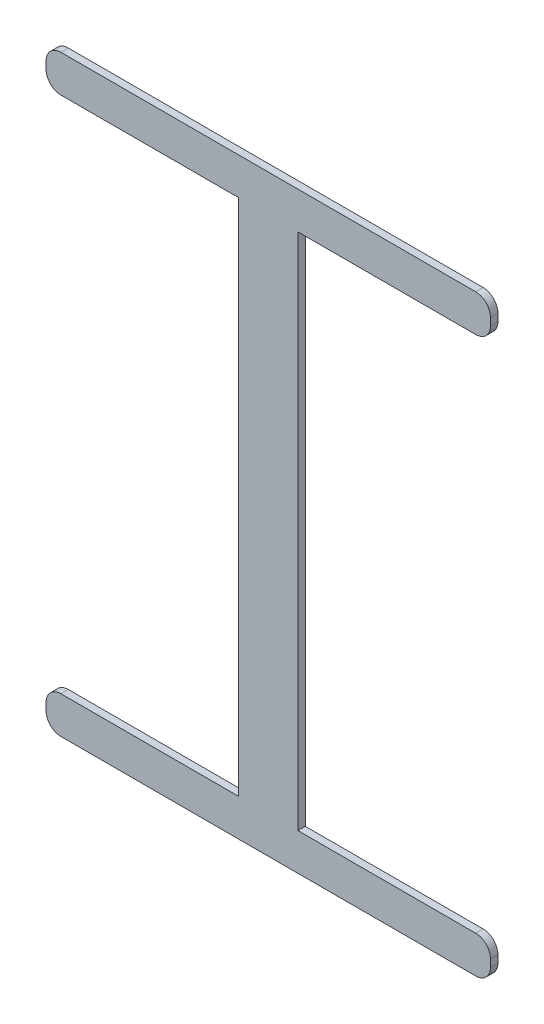
ISO-10303-21;
HEADER;
FILE_DESCRIPTION(('STEP AP214'),'2;1');
FILE_NAME('part.step','',(''),(''),'','','');
FILE_SCHEMA(('AUTOMOTIVE_DESIGN { 1 0 10303 214 1 1 1 1 }'));
ENDSEC;
DATA;
#1=APPLICATION_CONTEXT('core data for automotive mechanical design processes');
#2=APPLICATION_PROTOCOL_DEFINITION('international standard','automotive_design',2000,#1);
#3=PRODUCT_CONTEXT('',#1,'mechanical');
#4=PRODUCT('Part','Part','',(#3));
#5=PRODUCT_RELATED_PRODUCT_CATEGORY('part','',(#4));
#6=PRODUCT_DEFINITION_FORMATION('','',#4);
#7=PRODUCT_DEFINITION_CONTEXT('part definition',#1,'design');
#8=PRODUCT_DEFINITION('design','',#6,#7);
#9=PRODUCT_DEFINITION_SHAPE('','',#8);
#10=(LENGTH_UNIT() NAMED_UNIT(*) SI_UNIT(.MILLI.,.METRE.));
#11=(NAMED_UNIT(*) PLANE_ANGLE_UNIT() SI_UNIT($,.RADIAN.));
#12=(NAMED_UNIT(*) SI_UNIT($,.STERADIAN.) SOLID_ANGLE_UNIT());
#13=UNCERTAINTY_MEASURE_WITH_UNIT(LENGTH_MEASURE(1.E-05),#10,'distance_accuracy_value','');
#14=(GEOMETRIC_REPRESENTATION_CONTEXT(3) GLOBAL_UNCERTAINTY_ASSIGNED_CONTEXT((#13)) GLOBAL_UNIT_ASSIGNED_CONTEXT((#10,
#11,#12)) REPRESENTATION_CONTEXT('',''));
#15=CARTESIAN_POINT('',(0.,0.,0.));
#16=DIRECTION('',(0.,0.,1.));
#17=DIRECTION('',(1.,0.,0.));
#18=AXIS2_PLACEMENT_3D('',#15,#16,#17);
#19=CARTESIAN_POINT('',(8.00000000000001,70.,2.));
#20=DIRECTION('',(-1.,0.,0.));
#21=DIRECTION('',(0.,0.,1.));
#22=AXIS2_PLACEMENT_3D('',#19,#20,#21);
#23=PLANE('',#22);
#24=DIRECTION('',(0.,1.,0.));
#25=VECTOR('',#24,1.);
#26=CARTESIAN_POINT('',(8.00000000000001,70.,0.));
#27=LINE('',#26,#25);
#28=CARTESIAN_POINT('',(8.00000000000001,-70.,0.));
#29=VERTEX_POINT('',#28);
#30=CARTESIAN_POINT('',(8.00000000000001,70.,0.));
#31=VERTEX_POINT('',#30);
#32=EDGE_CURVE('E205',#29,#31,#27,.T.);
#33=ORIENTED_EDGE('',*,*,#32,.T.);
#34=DIRECTION('',(0.,0.,-1.));
#35=VECTOR('',#34,1.);
#36=CARTESIAN_POINT('',(8.00000000000001,70.,2.));
#37=LINE('',#36,#35);
#38=CARTESIAN_POINT('',(8.00000000000001,70.,2.));
#39=VERTEX_POINT('',#38);
#40=EDGE_CURVE('E11',#39,#31,#37,.T.);
#41=ORIENTED_EDGE('',*,*,#40,.F.);
#42=DIRECTION('',(0.,1.,0.));
#43=VECTOR('',#42,1.);
#44=CARTESIAN_POINT('',(8.00000000000001,70.,2.));
#45=LINE('',#44,#43);
#46=CARTESIAN_POINT('',(8.00000000000001,-70.,2.));
#47=VERTEX_POINT('',#46);
#48=EDGE_CURVE('E243',#47,#39,#45,.T.);
#49=ORIENTED_EDGE('',*,*,#48,.F.);
#50=DIRECTION('',(0.,0.,-1.));
#51=VECTOR('',#50,1.);
#52=CARTESIAN_POINT('',(8.00000000000001,-70.,2.));
#53=LINE('',#52,#51);
#54=EDGE_CURVE('E201',#47,#29,#53,.T.);
#55=ORIENTED_EDGE('',*,*,#54,.T.);
#56=EDGE_LOOP('',(#33,#41,#49,#55));
#57=FACE_BOUND('',#56,.T.);
#58=ADVANCED_FACE('F37',(#57),#23,.F.);
#59=CARTESIAN_POINT('',(56.,70.,2.));
#60=DIRECTION('',(0.,1.,0.));
#61=DIRECTION('',(0.,0.,1.));
#62=AXIS2_PLACEMENT_3D('',#59,#60,#61);
#63=PLANE('',#62);
#64=DIRECTION('',(1.,0.,0.));
#65=VECTOR('',#64,1.);
#66=CARTESIAN_POINT('',(56.,70.,0.));
#67=LINE('',#66,#65);
#68=CARTESIAN_POINT('',(56.,70.,0.));
#69=VERTEX_POINT('',#68);
#70=EDGE_CURVE('E208',#31,#69,#67,.T.);
#71=ORIENTED_EDGE('',*,*,#70,.T.);
#72=DIRECTION('',(0.,0.,-1.));
#73=VECTOR('',#72,1.);
#74=CARTESIAN_POINT('',(56.,70.,2.));
#75=LINE('',#74,#73);
#76=CARTESIAN_POINT('',(56.,70.,2.));
#77=VERTEX_POINT('',#76);
#78=EDGE_CURVE('E45',#77,#69,#75,.T.);
#79=ORIENTED_EDGE('',*,*,#78,.F.);
#80=DIRECTION('',(1.,0.,0.));
#81=VECTOR('',#80,1.);
#82=CARTESIAN_POINT('',(56.,70.,2.));
#83=LINE('',#82,#81);
#84=EDGE_CURVE('E132',#39,#77,#83,.T.);
#85=ORIENTED_EDGE('',*,*,#84,.F.);
#86=ORIENTED_EDGE('',*,*,#40,.T.);
#87=EDGE_LOOP('',(#71,#79,#85,#86));
#88=FACE_BOUND('',#87,.T.);
#89=ADVANCED_FACE('F361',(#88),#63,.F.);
#90=CARTESIAN_POINT('',(56.,74.,2.));
#91=DIRECTION('',(0.,0.,-1.));
#92=DIRECTION('',(-1.,0.,0.));
#93=AXIS2_PLACEMENT_3D('',#90,#91,#92);
#94=CYLINDRICAL_SURFACE('',#93,4.);
#95=CARTESIAN_POINT('',(56.,74.,0.));
#96=DIRECTION('',(0.,0.,1.));
#97=DIRECTION('',(1.,0.,0.));
#98=AXIS2_PLACEMENT_3D('',#95,#96,#97);
#99=CIRCLE('',#98,4.);
#100=CARTESIAN_POINT('',(60.,74.,0.));
#101=VERTEX_POINT('',#100);
#102=EDGE_CURVE('E210',#69,#101,#99,.T.);
#103=ORIENTED_EDGE('',*,*,#102,.T.);
#104=DIRECTION('',(0.,0.,-1.));
#105=VECTOR('',#104,1.);
#106=CARTESIAN_POINT('',(60.,74.,2.));
#107=LINE('',#106,#105);
#108=CARTESIAN_POINT('',(60.,74.,2.));
#109=VERTEX_POINT('',#108);
#110=EDGE_CURVE('E286',#109,#101,#107,.T.);
#111=ORIENTED_EDGE('',*,*,#110,.F.);
#112=CARTESIAN_POINT('',(56.,74.,2.));
#113=DIRECTION('',(0.,0.,1.));
#114=DIRECTION('',(1.,0.,0.));
#115=AXIS2_PLACEMENT_3D('',#112,#113,#114);
#116=CIRCLE('',#115,4.);
#117=EDGE_CURVE('E294',#77,#109,#116,.T.);
#118=ORIENTED_EDGE('',*,*,#117,.F.);
#119=ORIENTED_EDGE('',*,*,#78,.T.);
#120=EDGE_LOOP('',(#103,#111,#118,#119));
#121=FACE_BOUND('',#120,.T.);
#122=ADVANCED_FACE('F292',(#121),#94,.T.);
#123=CARTESIAN_POINT('',(60.,76.,2.));
#124=DIRECTION('',(-1.,0.,0.));
#125=DIRECTION('',(0.,-1.,0.));
#126=AXIS2_PLACEMENT_3D('',#123,#124,#125);
#127=PLANE('',#126);
#128=DIRECTION('',(0.,1.,0.));
#129=VECTOR('',#128,1.);
#130=CARTESIAN_POINT('',(60.,76.,0.));
#131=LINE('',#130,#129);
#132=CARTESIAN_POINT('',(60.,76.,0.));
#133=VERTEX_POINT('',#132);
#134=EDGE_CURVE('E212',#101,#133,#131,.T.);
#135=ORIENTED_EDGE('',*,*,#134,.T.);
#136=DIRECTION('',(0.,0.,-1.));
#137=VECTOR('',#136,1.);
#138=CARTESIAN_POINT('',(60.,76.,2.));
#139=LINE('',#138,#137);
#140=CARTESIAN_POINT('',(60.,76.,2.));
#141=VERTEX_POINT('',#140);
#142=EDGE_CURVE('E283',#141,#133,#139,.T.);
#143=ORIENTED_EDGE('',*,*,#142,.F.);
#144=DIRECTION('',(0.,1.,0.));
#145=VECTOR('',#144,1.);
#146=CARTESIAN_POINT('',(60.,76.,2.));
#147=LINE('',#146,#145);
#148=EDGE_CURVE('E312',#109,#141,#147,.T.);
#149=ORIENTED_EDGE('',*,*,#148,.F.);
#150=ORIENTED_EDGE('',*,*,#110,.T.);
#151=EDGE_LOOP('',(#135,#143,#149,#150));
#152=FACE_BOUND('',#151,.T.);
#153=ADVANCED_FACE('F303',(#152),#127,.F.);
#154=CARTESIAN_POINT('',(56.,76.,2.));
#155=DIRECTION('',(0.,0.,-1.));
#156=DIRECTION('',(-1.,0.,0.));
#157=AXIS2_PLACEMENT_3D('',#154,#155,#156);
#158=CYLINDRICAL_SURFACE('',#157,4.);
#159=CARTESIAN_POINT('',(56.,76.,0.));
#160=DIRECTION('',(0.,0.,1.));
#161=DIRECTION('',(1.,0.,0.));
#162=AXIS2_PLACEMENT_3D('',#159,#160,#161);
#163=CIRCLE('',#162,4.);
#164=CARTESIAN_POINT('',(56.,80.,0.));
#165=VERTEX_POINT('',#164);
#166=EDGE_CURVE('E214',#133,#165,#163,.T.);
#167=ORIENTED_EDGE('',*,*,#166,.T.);
#168=DIRECTION('',(0.,0.,-1.));
#169=VECTOR('',#168,1.);
#170=CARTESIAN_POINT('',(56.,80.,2.));
#171=LINE('',#170,#169);
#172=CARTESIAN_POINT('',(56.,80.,2.));
#173=VERTEX_POINT('',#172);
#174=EDGE_CURVE('E280',#173,#165,#171,.T.);
#175=ORIENTED_EDGE('',*,*,#174,.F.);
#176=CARTESIAN_POINT('',(56.,76.,2.));
#177=DIRECTION('',(0.,0.,1.));
#178=DIRECTION('',(1.,0.,0.));
#179=AXIS2_PLACEMENT_3D('',#176,#177,#178);
#180=CIRCLE('',#179,4.);
#181=EDGE_CURVE('E309',#141,#173,#180,.T.);
#182=ORIENTED_EDGE('',*,*,#181,.F.);
#183=ORIENTED_EDGE('',*,*,#142,.T.);
#184=EDGE_LOOP('',(#167,#175,#182,#183));
#185=FACE_BOUND('',#184,.T.);
#186=ADVANCED_FACE('F307',(#185),#158,.T.);
#187=CARTESIAN_POINT('',(-56.,80.,2.));
#188=DIRECTION('',(0.,-1.,0.));
#189=DIRECTION('',(0.,0.,-1.));
#190=AXIS2_PLACEMENT_3D('',#187,#188,#189);
#191=PLANE('',#190);
#192=DIRECTION('',(-1.,0.,0.));
#193=VECTOR('',#192,1.);
#194=CARTESIAN_POINT('',(-56.,80.,0.));
#195=LINE('',#194,#193);
#196=CARTESIAN_POINT('',(-56.,80.,0.));
#197=VERTEX_POINT('',#196);
#198=EDGE_CURVE('E216',#165,#197,#195,.T.);
#199=ORIENTED_EDGE('',*,*,#198,.T.);
#200=DIRECTION('',(0.,0.,-1.));
#201=VECTOR('',#200,1.);
#202=CARTESIAN_POINT('',(-56.,80.,2.));
#203=LINE('',#202,#201);
#204=CARTESIAN_POINT('',(-56.,80.,2.));
#205=VERTEX_POINT('',#204);
#206=EDGE_CURVE('E277',#205,#197,#203,.T.);
#207=ORIENTED_EDGE('',*,*,#206,.F.);
#208=DIRECTION('',(-1.,0.,0.));
#209=VECTOR('',#208,1.);
#210=CARTESIAN_POINT('',(-56.,80.,2.));
#211=LINE('',#210,#209);
#212=EDGE_CURVE('E311',#173,#205,#211,.T.);
#213=ORIENTED_EDGE('',*,*,#212,.F.);
#214=ORIENTED_EDGE('',*,*,#174,.T.);
#215=EDGE_LOOP('',(#199,#207,#213,#214));
#216=FACE_BOUND('',#215,.T.);
#217=ADVANCED_FACE('F374',(#216),#191,.F.);
#218=CARTESIAN_POINT('',(-56.,76.,2.));
#219=DIRECTION('',(0.,0.,-1.));
#220=DIRECTION('',(-1.,0.,0.));
#221=AXIS2_PLACEMENT_3D('',#218,#219,#220);
#222=CYLINDRICAL_SURFACE('',#221,4.);
#223=CARTESIAN_POINT('',(-56.,76.,0.));
#224=DIRECTION('',(0.,0.,1.));
#225=DIRECTION('',(-1.,0.,0.));
#226=AXIS2_PLACEMENT_3D('',#223,#224,#225);
#227=CIRCLE('',#226,4.);
#228=CARTESIAN_POINT('',(-60.,76.,0.));
#229=VERTEX_POINT('',#228);
#230=EDGE_CURVE('E218',#197,#229,#227,.T.);
#231=ORIENTED_EDGE('',*,*,#230,.T.);
#232=DIRECTION('',(0.,0.,-1.));
#233=VECTOR('',#232,1.);
#234=CARTESIAN_POINT('',(-60.,76.,2.));
#235=LINE('',#234,#233);
#236=CARTESIAN_POINT('',(-60.,76.,2.));
#237=VERTEX_POINT('',#236);
#238=EDGE_CURVE('E274',#237,#229,#235,.T.);
#239=ORIENTED_EDGE('',*,*,#238,.F.);
#240=CARTESIAN_POINT('',(-56.,76.,2.));
#241=DIRECTION('',(0.,0.,1.));
#242=DIRECTION('',(-1.,0.,0.));
#243=AXIS2_PLACEMENT_3D('',#240,#241,#242);
#244=CIRCLE('',#243,4.);
#245=EDGE_CURVE('E314',#205,#237,#244,.T.);
#246=ORIENTED_EDGE('',*,*,#245,.F.);
#247=ORIENTED_EDGE('',*,*,#206,.T.);
#248=EDGE_LOOP('',(#231,#239,#246,#247));
#249=FACE_BOUND('',#248,.T.);
#250=ADVANCED_FACE('F377',(#249),#222,.T.);
#251=CARTESIAN_POINT('',(-60.,76.,2.));
#252=DIRECTION('',(1.,0.,0.));
#253=DIRECTION('',(0.,1.,0.));
#254=AXIS2_PLACEMENT_3D('',#251,#252,#253);
#255=PLANE('',#254);
#256=DIRECTION('',(0.,-1.,0.));
#257=VECTOR('',#256,1.);
#258=CARTESIAN_POINT('',(-60.,76.,0.));
#259=LINE('',#258,#257);
#260=CARTESIAN_POINT('',(-60.,74.,0.));
#261=VERTEX_POINT('',#260);
#262=EDGE_CURVE('E220',#229,#261,#259,.T.);
#263=ORIENTED_EDGE('',*,*,#262,.T.);
#264=DIRECTION('',(0.,0.,-1.));
#265=VECTOR('',#264,1.);
#266=CARTESIAN_POINT('',(-60.,74.,2.));
#267=LINE('',#266,#265);
#268=CARTESIAN_POINT('',(-60.,74.,2.));
#269=VERTEX_POINT('',#268);
#270=EDGE_CURVE('E271',#269,#261,#267,.T.);
#271=ORIENTED_EDGE('',*,*,#270,.F.);
#272=DIRECTION('',(0.,-1.,0.));
#273=VECTOR('',#272,1.);
#274=CARTESIAN_POINT('',(-60.,76.,2.));
#275=LINE('',#274,#273);
#276=EDGE_CURVE('E320',#237,#269,#275,.T.);
#277=ORIENTED_EDGE('',*,*,#276,.F.);
#278=ORIENTED_EDGE('',*,*,#238,.T.);
#279=EDGE_LOOP('',(#263,#271,#277,#278));
#280=FACE_BOUND('',#279,.T.);
#281=ADVANCED_FACE('F381',(#280),#255,.F.);
#282=CARTESIAN_POINT('',(-56.,74.,2.));
#283=DIRECTION('',(0.,0.,-1.));
#284=DIRECTION('',(-1.,0.,0.));
#285=AXIS2_PLACEMENT_3D('',#282,#283,#284);
#286=CYLINDRICAL_SURFACE('',#285,4.);
#287=CARTESIAN_POINT('',(-56.,74.,0.));
#288=DIRECTION('',(0.,0.,1.));
#289=DIRECTION('',(-1.,0.,0.));
#290=AXIS2_PLACEMENT_3D('',#287,#288,#289);
#291=CIRCLE('',#290,4.);
#292=CARTESIAN_POINT('',(-56.,70.,0.));
#293=VERTEX_POINT('',#292);
#294=EDGE_CURVE('E222',#261,#293,#291,.T.);
#295=ORIENTED_EDGE('',*,*,#294,.T.);
#296=DIRECTION('',(0.,0.,-1.));
#297=VECTOR('',#296,1.);
#298=CARTESIAN_POINT('',(-56.,70.,2.));
#299=LINE('',#298,#297);
#300=CARTESIAN_POINT('',(-56.,70.,2.));
#301=VERTEX_POINT('',#300);
#302=EDGE_CURVE('E268',#301,#293,#299,.T.);
#303=ORIENTED_EDGE('',*,*,#302,.F.);
#304=CARTESIAN_POINT('',(-56.,74.,2.));
#305=DIRECTION('',(0.,0.,1.));
#306=DIRECTION('',(-1.,0.,0.));
#307=AXIS2_PLACEMENT_3D('',#304,#305,#306);
#308=CIRCLE('',#307,4.);
#309=EDGE_CURVE('E322',#269,#301,#308,.T.);
#310=ORIENTED_EDGE('',*,*,#309,.F.);
#311=ORIENTED_EDGE('',*,*,#270,.T.);
#312=EDGE_LOOP('',(#295,#303,#310,#311));
#313=FACE_BOUND('',#312,.T.);
#314=ADVANCED_FACE('F385',(#313),#286,.T.);
#315=CARTESIAN_POINT('',(-56.,70.,2.));
#316=DIRECTION('',(0.,1.,0.));
#317=DIRECTION('',(0.,0.,1.));
#318=AXIS2_PLACEMENT_3D('',#315,#316,#317);
#319=PLANE('',#318);
#320=DIRECTION('',(1.,0.,0.));
#321=VECTOR('',#320,1.);
#322=CARTESIAN_POINT('',(-56.,70.,0.));
#323=LINE('',#322,#321);
#324=CARTESIAN_POINT('',(-8.00000000000001,70.,0.));
#325=VERTEX_POINT('',#324);
#326=EDGE_CURVE('E224',#293,#325,#323,.T.);
#327=ORIENTED_EDGE('',*,*,#326,.T.);
#328=DIRECTION('',(0.,0.,-1.));
#329=VECTOR('',#328,1.);
#330=CARTESIAN_POINT('',(-8.00000000000001,70.,2.));
#331=LINE('',#330,#329);
#332=CARTESIAN_POINT('',(-8.00000000000001,70.,2.));
#333=VERTEX_POINT('',#332);
#334=EDGE_CURVE('E265',#333,#325,#331,.T.);
#335=ORIENTED_EDGE('',*,*,#334,.F.);
#336=DIRECTION('',(1.,0.,0.));
#337=VECTOR('',#336,1.);
#338=CARTESIAN_POINT('',(-56.,70.,2.));
#339=LINE('',#338,#337);
#340=EDGE_CURVE('E324',#301,#333,#339,.T.);
#341=ORIENTED_EDGE('',*,*,#340,.F.);
#342=ORIENTED_EDGE('',*,*,#302,.T.);
#343=EDGE_LOOP('',(#327,#335,#341,#342));
#344=FACE_BOUND('',#343,.T.);
#345=ADVANCED_FACE('F389',(#344),#319,.F.);
#346=CARTESIAN_POINT('',(-8.00000000000001,70.,2.));
#347=DIRECTION('',(1.,0.,0.));
#348=DIRECTION('',(0.,0.,-1.));
#349=AXIS2_PLACEMENT_3D('',#346,#347,#348);
#350=PLANE('',#349);
#351=DIRECTION('',(0.,-1.,0.));
#352=VECTOR('',#351,1.);
#353=CARTESIAN_POINT('',(-8.00000000000001,70.,0.));
#354=LINE('',#353,#352);
#355=CARTESIAN_POINT('',(-8.00000000000001,-70.,0.));
#356=VERTEX_POINT('',#355);
#357=EDGE_CURVE('E226',#325,#356,#354,.T.);
#358=ORIENTED_EDGE('',*,*,#357,.T.);
#359=DIRECTION('',(0.,0.,-1.));
#360=VECTOR('',#359,1.);
#361=CARTESIAN_POINT('',(-8.00000000000001,-70.,2.));
#362=LINE('',#361,#360);
#363=CARTESIAN_POINT('',(-8.00000000000001,-70.,2.));
#364=VERTEX_POINT('',#363);
#365=EDGE_CURVE('E262',#364,#356,#362,.T.);
#366=ORIENTED_EDGE('',*,*,#365,.F.);
#367=DIRECTION('',(0.,-1.,0.));
#368=VECTOR('',#367,1.);
#369=CARTESIAN_POINT('',(-8.00000000000001,70.,2.));
#370=LINE('',#369,#368);
#371=EDGE_CURVE('E326',#333,#364,#370,.T.);
#372=ORIENTED_EDGE('',*,*,#371,.F.);
#373=ORIENTED_EDGE('',*,*,#334,.T.);
#374=EDGE_LOOP('',(#358,#366,#372,#373));
#375=FACE_BOUND('',#374,.T.);
#376=ADVANCED_FACE('F393',(#375),#350,.F.);
#377=CARTESIAN_POINT('',(-56.,-70.,2.));
#378=DIRECTION('',(0.,-1.,0.));
#379=DIRECTION('',(0.,0.,-1.));
#380=AXIS2_PLACEMENT_3D('',#377,#378,#379);
#381=PLANE('',#380);
#382=DIRECTION('',(-1.,0.,0.));
#383=VECTOR('',#382,1.);
#384=CARTESIAN_POINT('',(-56.,-70.,0.));
#385=LINE('',#384,#383);
#386=CARTESIAN_POINT('',(-56.,-70.,0.));
#387=VERTEX_POINT('',#386);
#388=EDGE_CURVE('E228',#356,#387,#385,.T.);
#389=ORIENTED_EDGE('',*,*,#388,.T.);
#390=DIRECTION('',(0.,0.,-1.));
#391=VECTOR('',#390,1.);
#392=CARTESIAN_POINT('',(-56.,-70.,2.));
#393=LINE('',#392,#391);
#394=CARTESIAN_POINT('',(-56.,-70.,2.));
#395=VERTEX_POINT('',#394);
#396=EDGE_CURVE('E259',#395,#387,#393,.T.);
#397=ORIENTED_EDGE('',*,*,#396,.F.);
#398=DIRECTION('',(-1.,0.,0.));
#399=VECTOR('',#398,1.);
#400=CARTESIAN_POINT('',(-56.,-70.,2.));
#401=LINE('',#400,#399);
#402=EDGE_CURVE('E328',#364,#395,#401,.T.);
#403=ORIENTED_EDGE('',*,*,#402,.F.);
#404=ORIENTED_EDGE('',*,*,#365,.T.);
#405=EDGE_LOOP('',(#389,#397,#403,#404));
#406=FACE_BOUND('',#405,.T.);
#407=ADVANCED_FACE('F397',(#406),#381,.F.);
#408=CARTESIAN_POINT('',(-56.,-74.,2.));
#409=DIRECTION('',(0.,0.,-1.));
#410=DIRECTION('',(-1.,0.,0.));
#411=AXIS2_PLACEMENT_3D('',#408,#409,#410);
#412=CYLINDRICAL_SURFACE('',#411,4.);
#413=CARTESIAN_POINT('',(-56.,-74.,0.));
#414=DIRECTION('',(0.,0.,1.));
#415=DIRECTION('',(1.,0.,0.));
#416=AXIS2_PLACEMENT_3D('',#413,#414,#415);
#417=CIRCLE('',#416,4.);
#418=CARTESIAN_POINT('',(-60.,-74.,0.));
#419=VERTEX_POINT('',#418);
#420=EDGE_CURVE('E230',#387,#419,#417,.T.);
#421=ORIENTED_EDGE('',*,*,#420,.T.);
#422=DIRECTION('',(0.,0.,-1.));
#423=VECTOR('',#422,1.);
#424=CARTESIAN_POINT('',(-60.,-74.,2.));
#425=LINE('',#424,#423);
#426=CARTESIAN_POINT('',(-60.,-74.,2.));
#427=VERTEX_POINT('',#426);
#428=EDGE_CURVE('E256',#427,#419,#425,.T.);
#429=ORIENTED_EDGE('',*,*,#428,.F.);
#430=CARTESIAN_POINT('',(-56.,-74.,2.));
#431=DIRECTION('',(0.,0.,1.));
#432=DIRECTION('',(1.,0.,0.));
#433=AXIS2_PLACEMENT_3D('',#430,#431,#432);
#434=CIRCLE('',#433,4.);
#435=EDGE_CURVE('E330',#395,#427,#434,.T.);
#436=ORIENTED_EDGE('',*,*,#435,.F.);
#437=ORIENTED_EDGE('',*,*,#396,.T.);
#438=EDGE_LOOP('',(#421,#429,#436,#437));
#439=FACE_BOUND('',#438,.T.);
#440=ADVANCED_FACE('F401',(#439),#412,.T.);
#441=CARTESIAN_POINT('',(-60.,-76.,2.));
#442=DIRECTION('',(1.,0.,0.));
#443=DIRECTION('',(0.,1.,0.));
#444=AXIS2_PLACEMENT_3D('',#441,#442,#443);
#445=PLANE('',#444);
#446=DIRECTION('',(0.,-1.,0.));
#447=VECTOR('',#446,1.);
#448=CARTESIAN_POINT('',(-60.,-76.,0.));
#449=LINE('',#448,#447);
#450=CARTESIAN_POINT('',(-60.,-76.,0.));
#451=VERTEX_POINT('',#450);
#452=EDGE_CURVE('E232',#419,#451,#449,.T.);
#453=ORIENTED_EDGE('',*,*,#452,.T.);
#454=DIRECTION('',(0.,0.,-1.));
#455=VECTOR('',#454,1.);
#456=CARTESIAN_POINT('',(-60.,-76.,2.));
#457=LINE('',#456,#455);
#458=CARTESIAN_POINT('',(-60.,-76.,2.));
#459=VERTEX_POINT('',#458);
#460=EDGE_CURVE('E253',#459,#451,#457,.T.);
#461=ORIENTED_EDGE('',*,*,#460,.F.);
#462=DIRECTION('',(0.,-1.,0.));
#463=VECTOR('',#462,1.);
#464=CARTESIAN_POINT('',(-60.,-76.,2.));
#465=LINE('',#464,#463);
#466=EDGE_CURVE('E332',#427,#459,#465,.T.);
#467=ORIENTED_EDGE('',*,*,#466,.F.);
#468=ORIENTED_EDGE('',*,*,#428,.T.);
#469=EDGE_LOOP('',(#453,#461,#467,#468));
#470=FACE_BOUND('',#469,.T.);
#471=ADVANCED_FACE('F405',(#470),#445,.F.);
#472=CARTESIAN_POINT('',(-56.,-76.,2.));
#473=DIRECTION('',(0.,0.,-1.));
#474=DIRECTION('',(-1.,0.,0.));
#475=AXIS2_PLACEMENT_3D('',#472,#473,#474);
#476=CYLINDRICAL_SURFACE('',#475,4.);
#477=CARTESIAN_POINT('',(-56.,-76.,0.));
#478=DIRECTION('',(0.,0.,1.));
#479=DIRECTION('',(1.,0.,0.));
#480=AXIS2_PLACEMENT_3D('',#477,#478,#479);
#481=CIRCLE('',#480,4.);
#482=CARTESIAN_POINT('',(-56.,-80.,0.));
#483=VERTEX_POINT('',#482);
#484=EDGE_CURVE('E234',#451,#483,#481,.T.);
#485=ORIENTED_EDGE('',*,*,#484,.T.);
#486=DIRECTION('',(0.,0.,-1.));
#487=VECTOR('',#486,1.);
#488=CARTESIAN_POINT('',(-56.,-80.,2.));
#489=LINE('',#488,#487);
#490=CARTESIAN_POINT('',(-56.,-80.,2.));
#491=VERTEX_POINT('',#490);
#492=EDGE_CURVE('E250',#491,#483,#489,.T.);
#493=ORIENTED_EDGE('',*,*,#492,.F.);
#494=CARTESIAN_POINT('',(-56.,-76.,2.));
#495=DIRECTION('',(0.,0.,1.));
#496=DIRECTION('',(1.,0.,0.));
#497=AXIS2_PLACEMENT_3D('',#494,#495,#496);
#498=CIRCLE('',#497,4.);
#499=EDGE_CURVE('E334',#459,#491,#498,.T.);
#500=ORIENTED_EDGE('',*,*,#499,.F.);
#501=ORIENTED_EDGE('',*,*,#460,.T.);
#502=EDGE_LOOP('',(#485,#493,#500,#501));
#503=FACE_BOUND('',#502,.T.);
#504=ADVANCED_FACE('F409',(#503),#476,.T.);
#505=CARTESIAN_POINT('',(-56.,-80.,2.));
#506=DIRECTION('',(0.,1.,0.));
#507=DIRECTION('',(0.,0.,1.));
#508=AXIS2_PLACEMENT_3D('',#505,#506,#507);
#509=PLANE('',#508);
#510=DIRECTION('',(1.,0.,0.));
#511=VECTOR('',#510,1.);
#512=CARTESIAN_POINT('',(-56.,-80.,0.));
#513=LINE('',#512,#511);
#514=CARTESIAN_POINT('',(56.,-80.,0.));
#515=VERTEX_POINT('',#514);
#516=EDGE_CURVE('E236',#483,#515,#513,.T.);
#517=ORIENTED_EDGE('',*,*,#516,.T.);
#518=DIRECTION('',(0.,0.,-1.));
#519=VECTOR('',#518,1.);
#520=CARTESIAN_POINT('',(56.,-80.,2.));
#521=LINE('',#520,#519);
#522=CARTESIAN_POINT('',(56.,-80.,2.));
#523=VERTEX_POINT('',#522);
#524=EDGE_CURVE('E247',#523,#515,#521,.T.);
#525=ORIENTED_EDGE('',*,*,#524,.F.);
#526=DIRECTION('',(1.,0.,0.));
#527=VECTOR('',#526,1.);
#528=CARTESIAN_POINT('',(-56.,-80.,2.));
#529=LINE('',#528,#527);
#530=EDGE_CURVE('E336',#491,#523,#529,.T.);
#531=ORIENTED_EDGE('',*,*,#530,.F.);
#532=ORIENTED_EDGE('',*,*,#492,.T.);
#533=EDGE_LOOP('',(#517,#525,#531,#532));
#534=FACE_BOUND('',#533,.T.);
#535=ADVANCED_FACE('F342',(#534),#509,.F.);
#536=CARTESIAN_POINT('',(56.,-76.,2.));
#537=DIRECTION('',(0.,0.,-1.));
#538=DIRECTION('',(-1.,0.,0.));
#539=AXIS2_PLACEMENT_3D('',#536,#537,#538);
#540=CYLINDRICAL_SURFACE('',#539,4.);
#541=CARTESIAN_POINT('',(56.,-76.,0.));
#542=DIRECTION('',(0.,0.,1.));
#543=DIRECTION('',(-1.,0.,0.));
#544=AXIS2_PLACEMENT_3D('',#541,#542,#543);
#545=CIRCLE('',#544,4.);
#546=CARTESIAN_POINT('',(60.,-76.,0.));
#547=VERTEX_POINT('',#546);
#548=EDGE_CURVE('E238',#515,#547,#545,.T.);
#549=ORIENTED_EDGE('',*,*,#548,.T.);
#550=DIRECTION('',(0.,0.,-1.));
#551=VECTOR('',#550,1.);
#552=CARTESIAN_POINT('',(60.,-76.,2.));
#553=LINE('',#552,#551);
#554=CARTESIAN_POINT('',(60.,-76.,2.));
#555=VERTEX_POINT('',#554);
#556=EDGE_CURVE('E196',#555,#547,#553,.T.);
#557=ORIENTED_EDGE('',*,*,#556,.F.);
#558=CARTESIAN_POINT('',(56.,-76.,2.));
#559=DIRECTION('',(0.,0.,1.));
#560=DIRECTION('',(-1.,0.,0.));
#561=AXIS2_PLACEMENT_3D('',#558,#559,#560);
#562=CIRCLE('',#561,4.);
#563=EDGE_CURVE('E187',#523,#555,#562,.T.);
#564=ORIENTED_EDGE('',*,*,#563,.F.);
#565=ORIENTED_EDGE('',*,*,#524,.T.);
#566=EDGE_LOOP('',(#549,#557,#564,#565));
#567=FACE_BOUND('',#566,.T.);
#568=ADVANCED_FACE('F346',(#567),#540,.T.);
#569=CARTESIAN_POINT('',(60.,-76.,2.));
#570=DIRECTION('',(-1.,0.,0.));
#571=DIRECTION('',(0.,-1.,0.));
#572=AXIS2_PLACEMENT_3D('',#569,#570,#571);
#573=PLANE('',#572);
#574=DIRECTION('',(0.,1.,0.));
#575=VECTOR('',#574,1.);
#576=CARTESIAN_POINT('',(60.,-76.,0.));
#577=LINE('',#576,#575);
#578=CARTESIAN_POINT('',(60.,-74.,0.));
#579=VERTEX_POINT('',#578);
#580=EDGE_CURVE('E195',#547,#579,#577,.T.);
#581=ORIENTED_EDGE('',*,*,#580,.T.);
#582=DIRECTION('',(0.,0.,-1.));
#583=VECTOR('',#582,1.);
#584=CARTESIAN_POINT('',(60.,-74.,2.));
#585=LINE('',#584,#583);
#586=CARTESIAN_POINT('',(60.,-74.,2.));
#587=VERTEX_POINT('',#586);
#588=EDGE_CURVE('E192',#587,#579,#585,.T.);
#589=ORIENTED_EDGE('',*,*,#588,.F.);
#590=DIRECTION('',(0.,1.,0.));
#591=VECTOR('',#590,1.);
#592=CARTESIAN_POINT('',(60.,-76.,2.));
#593=LINE('',#592,#591);
#594=EDGE_CURVE('E181',#555,#587,#593,.T.);
#595=ORIENTED_EDGE('',*,*,#594,.F.);
#596=ORIENTED_EDGE('',*,*,#556,.T.);
#597=EDGE_LOOP('',(#581,#589,#595,#596));
#598=FACE_BOUND('',#597,.T.);
#599=ADVANCED_FACE('F193',(#598),#573,.F.);
#600=CARTESIAN_POINT('',(56.,-74.,2.));
#601=DIRECTION('',(0.,0.,-1.));
#602=DIRECTION('',(-1.,0.,0.));
#603=AXIS2_PLACEMENT_3D('',#600,#601,#602);
#604=CYLINDRICAL_SURFACE('',#603,4.);
#605=CARTESIAN_POINT('',(56.,-74.,0.));
#606=DIRECTION('',(0.,0.,1.));
#607=DIRECTION('',(-1.,0.,0.));
#608=AXIS2_PLACEMENT_3D('',#605,#606,#607);
#609=CIRCLE('',#608,4.);
#610=CARTESIAN_POINT('',(56.,-70.,0.));
#611=VERTEX_POINT('',#610);
#612=EDGE_CURVE('E118',#579,#611,#609,.T.);
#613=ORIENTED_EDGE('',*,*,#612,.T.);
#614=DIRECTION('',(0.,0.,-1.));
#615=VECTOR('',#614,1.);
#616=CARTESIAN_POINT('',(56.,-70.,2.));
#617=LINE('',#616,#615);
#618=CARTESIAN_POINT('',(56.,-70.,2.));
#619=VERTEX_POINT('',#618);
#620=EDGE_CURVE('E197',#619,#611,#617,.T.);
#621=ORIENTED_EDGE('',*,*,#620,.F.);
#622=CARTESIAN_POINT('',(56.,-74.,2.));
#623=DIRECTION('',(0.,0.,1.));
#624=DIRECTION('',(-1.,0.,0.));
#625=AXIS2_PLACEMENT_3D('',#622,#623,#624);
#626=CIRCLE('',#625,4.);
#627=EDGE_CURVE('E185',#587,#619,#626,.T.);
#628=ORIENTED_EDGE('',*,*,#627,.F.);
#629=ORIENTED_EDGE('',*,*,#588,.T.);
#630=EDGE_LOOP('',(#613,#621,#628,#629));
#631=FACE_BOUND('',#630,.T.);
#632=ADVANCED_FACE('F199',(#631),#604,.T.);
#633=CARTESIAN_POINT('',(56.,-70.,2.));
#634=DIRECTION('',(0.,-1.,0.));
#635=DIRECTION('',(0.,0.,-1.));
#636=AXIS2_PLACEMENT_3D('',#633,#634,#635);
#637=PLANE('',#636);
#638=DIRECTION('',(-1.,0.,0.));
#639=VECTOR('',#638,1.);
#640=CARTESIAN_POINT('',(56.,-70.,0.));
#641=LINE('',#640,#639);
#642=EDGE_CURVE('E124',#611,#29,#641,.T.);
#643=ORIENTED_EDGE('',*,*,#642,.T.);
#644=ORIENTED_EDGE('',*,*,#54,.F.);
#645=DIRECTION('',(-1.,0.,0.));
#646=VECTOR('',#645,1.);
#647=CARTESIAN_POINT('',(56.,-70.,2.));
#648=LINE('',#647,#646);
#649=EDGE_CURVE('E53',#619,#47,#648,.T.);
#650=ORIENTED_EDGE('',*,*,#649,.F.);
#651=ORIENTED_EDGE('',*,*,#620,.T.);
#652=EDGE_LOOP('',(#643,#644,#650,#651));
#653=FACE_BOUND('',#652,.T.);
#654=ADVANCED_FACE('F350',(#653),#637,.F.);
#655=CARTESIAN_POINT('',(56.,-74.,2.));
#656=DIRECTION('',(0.,0.,-1.));
#657=DIRECTION('',(-1.,0.,0.));
#658=AXIS2_PLACEMENT_3D('',#655,#656,#657);
#659=PLANE('',#658);
#660=ORIENTED_EDGE('',*,*,#48,.T.);
#661=ORIENTED_EDGE('',*,*,#84,.T.);
#662=ORIENTED_EDGE('',*,*,#117,.T.);
#663=ORIENTED_EDGE('',*,*,#148,.T.);
#664=ORIENTED_EDGE('',*,*,#181,.T.);
#665=ORIENTED_EDGE('',*,*,#212,.T.);
#666=ORIENTED_EDGE('',*,*,#245,.T.);
#667=ORIENTED_EDGE('',*,*,#276,.T.);
#668=ORIENTED_EDGE('',*,*,#309,.T.);
#669=ORIENTED_EDGE('',*,*,#340,.T.);
#670=ORIENTED_EDGE('',*,*,#371,.T.);
#671=ORIENTED_EDGE('',*,*,#402,.T.);
#672=ORIENTED_EDGE('',*,*,#435,.T.);
#673=ORIENTED_EDGE('',*,*,#466,.T.);
#674=ORIENTED_EDGE('',*,*,#499,.T.);
#675=ORIENTED_EDGE('',*,*,#530,.T.);
#676=ORIENTED_EDGE('',*,*,#563,.T.);
#677=ORIENTED_EDGE('',*,*,#594,.T.);
#678=ORIENTED_EDGE('',*,*,#627,.T.);
#679=ORIENTED_EDGE('',*,*,#649,.T.);
#680=EDGE_LOOP('',(#660,#661,#662,#663,#664,#665,#666,#667,#668,#669,#670,#671,#672,#673,#674,
#675,#676,#677,#678,#679));
#681=FACE_BOUND('',#680,.T.);
#682=ADVANCED_FACE('F183',(#681),#659,.F.);
#683=CARTESIAN_POINT('',(56.,-74.,0.));
#684=DIRECTION('',(0.,0.,-1.));
#685=DIRECTION('',(-1.,0.,0.));
#686=AXIS2_PLACEMENT_3D('',#683,#684,#685);
#687=PLANE('',#686);
#688=ORIENTED_EDGE('',*,*,#32,.F.);
#689=ORIENTED_EDGE('',*,*,#642,.F.);
#690=ORIENTED_EDGE('',*,*,#612,.F.);
#691=ORIENTED_EDGE('',*,*,#580,.F.);
#692=ORIENTED_EDGE('',*,*,#548,.F.);
#693=ORIENTED_EDGE('',*,*,#516,.F.);
#694=ORIENTED_EDGE('',*,*,#484,.F.);
#695=ORIENTED_EDGE('',*,*,#452,.F.);
#696=ORIENTED_EDGE('',*,*,#420,.F.);
#697=ORIENTED_EDGE('',*,*,#388,.F.);
#698=ORIENTED_EDGE('',*,*,#357,.F.);
#699=ORIENTED_EDGE('',*,*,#326,.F.);
#700=ORIENTED_EDGE('',*,*,#294,.F.);
#701=ORIENTED_EDGE('',*,*,#262,.F.);
#702=ORIENTED_EDGE('',*,*,#230,.F.);
#703=ORIENTED_EDGE('',*,*,#198,.F.);
#704=ORIENTED_EDGE('',*,*,#166,.F.);
#705=ORIENTED_EDGE('',*,*,#134,.F.);
#706=ORIENTED_EDGE('',*,*,#102,.F.);
#707=ORIENTED_EDGE('',*,*,#70,.F.);
#708=EDGE_LOOP('',(#688,#689,#690,#691,#692,#693,#694,#695,#696,#697,#698,#699,#700,#701,#702,
#703,#704,#705,#706,#707));
#709=FACE_BOUND('',#708,.T.);
#710=ADVANCED_FACE('F298',(#709),#687,.T.);
#711=CLOSED_SHELL('',(#58,#89,#122,#153,#186,#217,#250,#281,#314,#345,#376,#407,#440,#471,#504,
#535,#568,#599,#632,#654,#682,#710));
#712=MANIFOLD_SOLID_BREP('B2',#711);
#713=ADVANCED_BREP_SHAPE_REPRESENTATION('',(#18,#712),#14);
#714=SHAPE_DEFINITION_REPRESENTATION(#9,#713);
ENDSEC;
END-ISO-10303-21;
